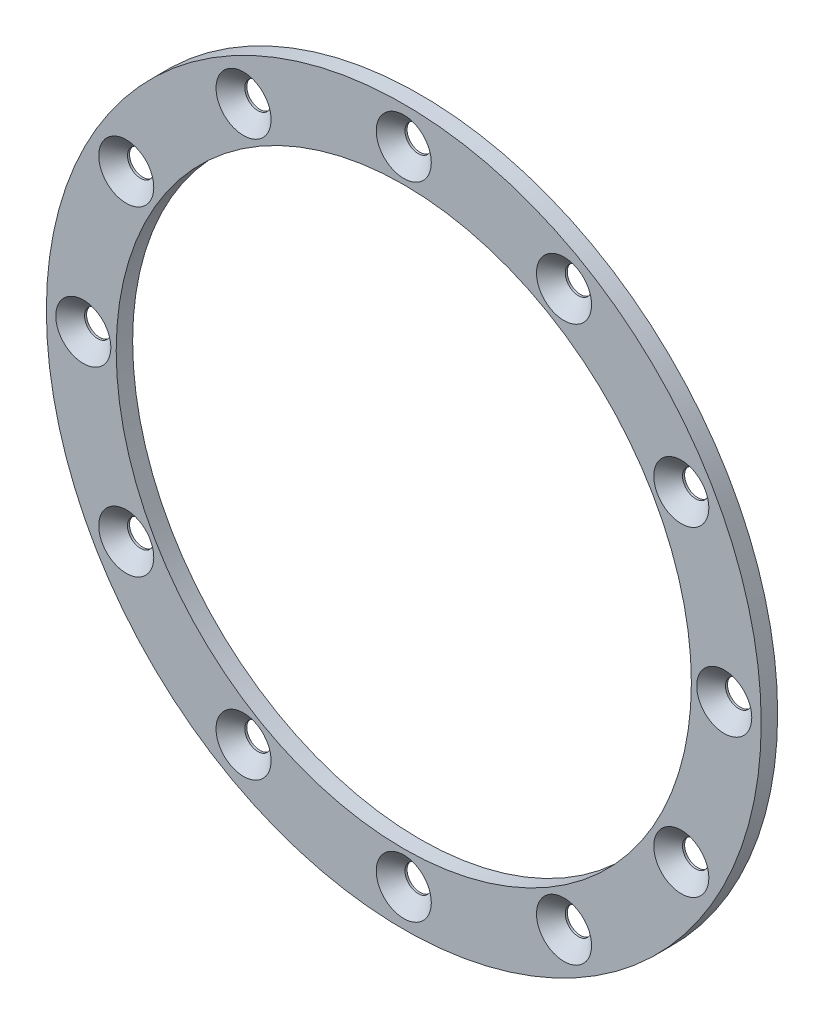
ISO-10303-21;
HEADER;
FILE_DESCRIPTION(('STEP AP214'),'2;1');
FILE_NAME('part.step','',(''),(''),'','','');
FILE_SCHEMA(('AUTOMOTIVE_DESIGN { 1 0 10303 214 1 1 1 1 }'));
ENDSEC;
DATA;
#1=APPLICATION_CONTEXT('core data for automotive mechanical design processes');
#2=APPLICATION_PROTOCOL_DEFINITION('international standard','automotive_design',2000,#1);
#3=PRODUCT_CONTEXT('',#1,'mechanical');
#4=PRODUCT('Part','Part','',(#3));
#5=PRODUCT_RELATED_PRODUCT_CATEGORY('part','',(#4));
#6=PRODUCT_DEFINITION_FORMATION('','',#4);
#7=PRODUCT_DEFINITION_CONTEXT('part definition',#1,'design');
#8=PRODUCT_DEFINITION('design','',#6,#7);
#9=PRODUCT_DEFINITION_SHAPE('','',#8);
#10=(LENGTH_UNIT() NAMED_UNIT(*) SI_UNIT(.MILLI.,.METRE.));
#11=(NAMED_UNIT(*) PLANE_ANGLE_UNIT() SI_UNIT($,.RADIAN.));
#12=(NAMED_UNIT(*) SI_UNIT($,.STERADIAN.) SOLID_ANGLE_UNIT());
#13=UNCERTAINTY_MEASURE_WITH_UNIT(LENGTH_MEASURE(1.E-05),#10,'distance_accuracy_value','');
#14=(GEOMETRIC_REPRESENTATION_CONTEXT(3) GLOBAL_UNCERTAINTY_ASSIGNED_CONTEXT((#13)) GLOBAL_UNIT_ASSIGNED_CONTEXT((#10,
#11,#12)) REPRESENTATION_CONTEXT('',''));
#15=CARTESIAN_POINT('',(0.,0.,0.));
#16=DIRECTION('',(0.,0.,1.));
#17=DIRECTION('',(1.,0.,0.));
#18=AXIS2_PLACEMENT_3D('',#15,#16,#17);
#19=CARTESIAN_POINT('',(0.,0.,2.));
#20=DIRECTION('',(0.,0.,1.));
#21=DIRECTION('',(1.,0.,0.));
#22=AXIS2_PLACEMENT_3D('',#19,#20,#21);
#23=PLANE('',#22);
#24=CARTESIAN_POINT('',(19.4999999999996,33.7749907475933,2.));
#25=DIRECTION('',(0.,0.,1.));
#26=DIRECTION('',(1.,0.,0.));
#27=AXIS2_PLACEMENT_3D('',#24,#25,#26);
#28=CIRCLE('',#27,3.35);
#29=CARTESIAN_POINT('',(22.8499999999996,33.7749907475933,2.));
#30=VERTEX_POINT('',#29);
#31=EDGE_CURVE('E155',#30,#30,#28,.T.);
#32=ORIENTED_EDGE('',*,*,#31,.F.);
#33=EDGE_LOOP('',(#32));
#34=FACE_BOUND('',#33,.T.);
#35=CARTESIAN_POINT('',(33.7749907475929,19.5000000000004,2.));
#36=DIRECTION('',(0.,0.,1.));
#37=DIRECTION('',(1.,0.,0.));
#38=AXIS2_PLACEMENT_3D('',#35,#36,#37);
#39=CIRCLE('',#38,3.35);
#40=CARTESIAN_POINT('',(37.1249907475929,19.5000000000004,2.));
#41=VERTEX_POINT('',#40);
#42=EDGE_CURVE('E146',#41,#41,#39,.T.);
#43=ORIENTED_EDGE('',*,*,#42,.F.);
#44=EDGE_LOOP('',(#43));
#45=FACE_BOUND('',#44,.T.);
#46=CARTESIAN_POINT('',(39.,4.08503316644647E-13,2.));
#47=DIRECTION('',(0.,0.,1.));
#48=DIRECTION('',(1.,0.,0.));
#49=AXIS2_PLACEMENT_3D('',#46,#47,#48);
#50=CIRCLE('',#49,3.35);
#51=CARTESIAN_POINT('',(42.35,4.08503316644647E-13,2.));
#52=VERTEX_POINT('',#51);
#53=EDGE_CURVE('E137',#52,#52,#50,.T.);
#54=ORIENTED_EDGE('',*,*,#53,.F.);
#55=EDGE_LOOP('',(#54));
#56=FACE_BOUND('',#55,.T.);
#57=CARTESIAN_POINT('',(33.7749907475933,-19.4999999999997,2.));
#58=DIRECTION('',(0.,0.,1.));
#59=DIRECTION('',(1.,0.,0.));
#60=AXIS2_PLACEMENT_3D('',#57,#58,#59);
#61=CIRCLE('',#60,3.35);
#62=CARTESIAN_POINT('',(37.1249907475933,-19.4999999999997,2.));
#63=VERTEX_POINT('',#62);
#64=EDGE_CURVE('E128',#63,#63,#61,.T.);
#65=ORIENTED_EDGE('',*,*,#64,.F.);
#66=EDGE_LOOP('',(#65));
#67=FACE_BOUND('',#66,.T.);
#68=CARTESIAN_POINT('',(19.5000000000003,-33.774990747593,2.));
#69=DIRECTION('',(0.,0.,1.));
#70=DIRECTION('',(1.,0.,0.));
#71=AXIS2_PLACEMENT_3D('',#68,#69,#70);
#72=CIRCLE('',#71,3.35);
#73=CARTESIAN_POINT('',(22.8500000000003,-33.774990747593,2.));
#74=VERTEX_POINT('',#73);
#75=EDGE_CURVE('E119',#74,#74,#72,.T.);
#76=ORIENTED_EDGE('',*,*,#75,.F.);
#77=EDGE_LOOP('',(#76));
#78=FACE_BOUND('',#77,.T.);
#79=CARTESIAN_POINT('',(0.,-39.,2.));
#80=DIRECTION('',(0.,0.,1.));
#81=DIRECTION('',(1.,0.,0.));
#82=AXIS2_PLACEMENT_3D('',#79,#80,#81);
#83=CIRCLE('',#82,3.35);
#84=CARTESIAN_POINT('',(3.35,-39.,2.));
#85=VERTEX_POINT('',#84);
#86=EDGE_CURVE('E110',#85,#85,#83,.T.);
#87=ORIENTED_EDGE('',*,*,#86,.F.);
#88=EDGE_LOOP('',(#87));
#89=FACE_BOUND('',#88,.T.);
#90=CARTESIAN_POINT('',(-19.4999999999998,-33.7749907475932,2.));
#91=DIRECTION('',(0.,0.,1.));
#92=DIRECTION('',(1.,0.,0.));
#93=AXIS2_PLACEMENT_3D('',#90,#91,#92);
#94=CIRCLE('',#93,3.35);
#95=CARTESIAN_POINT('',(-16.1499999999998,-33.7749907475932,2.));
#96=VERTEX_POINT('',#95);
#97=EDGE_CURVE('E101',#96,#96,#94,.T.);
#98=ORIENTED_EDGE('',*,*,#97,.F.);
#99=EDGE_LOOP('',(#98));
#100=FACE_BOUND('',#99,.T.);
#101=CARTESIAN_POINT('',(-33.774990747593,-19.5000000000002,2.));
#102=DIRECTION('',(0.,0.,1.));
#103=DIRECTION('',(1.,0.,0.));
#104=AXIS2_PLACEMENT_3D('',#101,#102,#103);
#105=CIRCLE('',#104,3.35);
#106=CARTESIAN_POINT('',(-30.424990747593,-19.5000000000002,2.));
#107=VERTEX_POINT('',#106);
#108=EDGE_CURVE('E92',#107,#107,#105,.T.);
#109=ORIENTED_EDGE('',*,*,#108,.F.);
#110=EDGE_LOOP('',(#109));
#111=FACE_BOUND('',#110,.T.);
#112=CARTESIAN_POINT('',(-39.,-1.36167772214882E-13,2.));
#113=DIRECTION('',(0.,0.,1.));
#114=DIRECTION('',(1.,0.,0.));
#115=AXIS2_PLACEMENT_3D('',#112,#113,#114);
#116=CIRCLE('',#115,3.35);
#117=CARTESIAN_POINT('',(-35.65,-1.36167772214882E-13,2.));
#118=VERTEX_POINT('',#117);
#119=EDGE_CURVE('E83',#118,#118,#116,.T.);
#120=ORIENTED_EDGE('',*,*,#119,.F.);
#121=EDGE_LOOP('',(#120));
#122=FACE_BOUND('',#121,.T.);
#123=CARTESIAN_POINT('',(-33.7749907475932,19.4999999999999,2.));
#124=DIRECTION('',(0.,0.,1.));
#125=DIRECTION('',(1.,0.,0.));
#126=AXIS2_PLACEMENT_3D('',#123,#124,#125);
#127=CIRCLE('',#126,3.35);
#128=CARTESIAN_POINT('',(-30.4249907475932,19.4999999999999,2.));
#129=VERTEX_POINT('',#128);
#130=EDGE_CURVE('E74',#129,#129,#127,.T.);
#131=ORIENTED_EDGE('',*,*,#130,.F.);
#132=EDGE_LOOP('',(#131));
#133=FACE_BOUND('',#132,.T.);
#134=CARTESIAN_POINT('',(-19.5,33.7749907475931,2.));
#135=DIRECTION('',(0.,0.,1.));
#136=DIRECTION('',(1.,0.,0.));
#137=AXIS2_PLACEMENT_3D('',#134,#135,#136);
#138=CIRCLE('',#137,3.35);
#139=CARTESIAN_POINT('',(-16.15,33.7749907475931,2.));
#140=VERTEX_POINT('',#139);
#141=EDGE_CURVE('E65',#140,#140,#138,.T.);
#142=ORIENTED_EDGE('',*,*,#141,.F.);
#143=EDGE_LOOP('',(#142));
#144=FACE_BOUND('',#143,.T.);
#145=CARTESIAN_POINT('',(0.,39.,2.));
#146=DIRECTION('',(0.,0.,1.));
#147=DIRECTION('',(1.,0.,0.));
#148=AXIS2_PLACEMENT_3D('',#145,#146,#147);
#149=CIRCLE('',#148,3.35);
#150=CARTESIAN_POINT('',(3.35,39.,2.));
#151=VERTEX_POINT('',#150);
#152=EDGE_CURVE('E56',#151,#151,#149,.T.);
#153=ORIENTED_EDGE('',*,*,#152,.F.);
#154=EDGE_LOOP('',(#153));
#155=FACE_BOUND('',#154,.T.);
#156=CARTESIAN_POINT('',(0.,0.,2.));
#157=DIRECTION('',(0.,0.,1.));
#158=DIRECTION('',(1.,0.,0.));
#159=AXIS2_PLACEMENT_3D('',#156,#157,#158);
#160=CIRCLE('',#159,43.5);
#161=CARTESIAN_POINT('',(43.5,0.,2.));
#162=VERTEX_POINT('',#161);
#163=EDGE_CURVE('E10',#162,#162,#160,.T.);
#164=ORIENTED_EDGE('',*,*,#163,.T.);
#165=EDGE_LOOP('',(#164));
#166=FACE_BOUND('',#165,.T.);
#167=CARTESIAN_POINT('',(0.,0.,2.));
#168=DIRECTION('',(0.,0.,1.));
#169=DIRECTION('',(1.,0.,0.));
#170=AXIS2_PLACEMENT_3D('',#167,#168,#169);
#171=CIRCLE('',#170,35.);
#172=CARTESIAN_POINT('',(35.,0.,2.));
#173=VERTEX_POINT('',#172);
#174=EDGE_CURVE('E43',#173,#173,#171,.T.);
#175=ORIENTED_EDGE('',*,*,#174,.F.);
#176=EDGE_LOOP('',(#175));
#177=FACE_BOUND('',#176,.T.);
#178=ADVANCED_FACE('F32',(#34,#45,#56,#67,#78,#89,#100,#111,#122,#133,#144,#155,#166,#177),#23,.T.);
#179=CARTESIAN_POINT('',(0.,0.,0.));
#180=DIRECTION('',(0.,0.,1.));
#181=DIRECTION('',(1.,0.,0.));
#182=AXIS2_PLACEMENT_3D('',#179,#180,#181);
#183=PLANE('',#182);
#184=CARTESIAN_POINT('',(19.4999999999996,33.7749907475933,0.));
#185=DIRECTION('',(0.,0.,1.));
#186=DIRECTION('',(1.,0.,0.));
#187=AXIS2_PLACEMENT_3D('',#184,#185,#186);
#188=CIRCLE('',#187,1.6);
#189=CARTESIAN_POINT('',(21.0999999999996,33.7749907475933,0.));
#190=VERTEX_POINT('',#189);
#191=EDGE_CURVE('E149',#190,#190,#188,.T.);
#192=ORIENTED_EDGE('',*,*,#191,.T.);
#193=EDGE_LOOP('',(#192));
#194=FACE_BOUND('',#193,.T.);
#195=CARTESIAN_POINT('',(33.7749907475929,19.5000000000004,0.));
#196=DIRECTION('',(0.,0.,1.));
#197=DIRECTION('',(1.,0.,0.));
#198=AXIS2_PLACEMENT_3D('',#195,#196,#197);
#199=CIRCLE('',#198,1.6);
#200=CARTESIAN_POINT('',(35.3749907475929,19.5000000000004,0.));
#201=VERTEX_POINT('',#200);
#202=EDGE_CURVE('E140',#201,#201,#199,.T.);
#203=ORIENTED_EDGE('',*,*,#202,.T.);
#204=EDGE_LOOP('',(#203));
#205=FACE_BOUND('',#204,.T.);
#206=CARTESIAN_POINT('',(39.,4.08503316644647E-13,0.));
#207=DIRECTION('',(0.,0.,1.));
#208=DIRECTION('',(1.,0.,0.));
#209=AXIS2_PLACEMENT_3D('',#206,#207,#208);
#210=CIRCLE('',#209,1.6);
#211=CARTESIAN_POINT('',(40.6,4.08503316644647E-13,0.));
#212=VERTEX_POINT('',#211);
#213=EDGE_CURVE('E131',#212,#212,#210,.T.);
#214=ORIENTED_EDGE('',*,*,#213,.T.);
#215=EDGE_LOOP('',(#214));
#216=FACE_BOUND('',#215,.T.);
#217=CARTESIAN_POINT('',(33.7749907475933,-19.4999999999997,0.));
#218=DIRECTION('',(0.,0.,1.));
#219=DIRECTION('',(1.,0.,0.));
#220=AXIS2_PLACEMENT_3D('',#217,#218,#219);
#221=CIRCLE('',#220,1.6);
#222=CARTESIAN_POINT('',(35.3749907475933,-19.4999999999997,0.));
#223=VERTEX_POINT('',#222);
#224=EDGE_CURVE('E122',#223,#223,#221,.T.);
#225=ORIENTED_EDGE('',*,*,#224,.T.);
#226=EDGE_LOOP('',(#225));
#227=FACE_BOUND('',#226,.T.);
#228=CARTESIAN_POINT('',(19.5000000000003,-33.774990747593,0.));
#229=DIRECTION('',(0.,0.,1.));
#230=DIRECTION('',(1.,0.,0.));
#231=AXIS2_PLACEMENT_3D('',#228,#229,#230);
#232=CIRCLE('',#231,1.6);
#233=CARTESIAN_POINT('',(21.1000000000003,-33.774990747593,0.));
#234=VERTEX_POINT('',#233);
#235=EDGE_CURVE('E113',#234,#234,#232,.T.);
#236=ORIENTED_EDGE('',*,*,#235,.T.);
#237=EDGE_LOOP('',(#236));
#238=FACE_BOUND('',#237,.T.);
#239=CARTESIAN_POINT('',(0.,-39.,0.));
#240=DIRECTION('',(0.,0.,1.));
#241=DIRECTION('',(1.,0.,0.));
#242=AXIS2_PLACEMENT_3D('',#239,#240,#241);
#243=CIRCLE('',#242,1.6);
#244=CARTESIAN_POINT('',(1.6,-39.,0.));
#245=VERTEX_POINT('',#244);
#246=EDGE_CURVE('E104',#245,#245,#243,.T.);
#247=ORIENTED_EDGE('',*,*,#246,.T.);
#248=EDGE_LOOP('',(#247));
#249=FACE_BOUND('',#248,.T.);
#250=CARTESIAN_POINT('',(-19.4999999999998,-33.7749907475932,0.));
#251=DIRECTION('',(0.,0.,1.));
#252=DIRECTION('',(1.,0.,0.));
#253=AXIS2_PLACEMENT_3D('',#250,#251,#252);
#254=CIRCLE('',#253,1.6);
#255=CARTESIAN_POINT('',(-17.8999999999998,-33.7749907475932,0.));
#256=VERTEX_POINT('',#255);
#257=EDGE_CURVE('E95',#256,#256,#254,.T.);
#258=ORIENTED_EDGE('',*,*,#257,.T.);
#259=EDGE_LOOP('',(#258));
#260=FACE_BOUND('',#259,.T.);
#261=CARTESIAN_POINT('',(-33.774990747593,-19.5000000000002,0.));
#262=DIRECTION('',(0.,0.,1.));
#263=DIRECTION('',(1.,0.,0.));
#264=AXIS2_PLACEMENT_3D('',#261,#262,#263);
#265=CIRCLE('',#264,1.6);
#266=CARTESIAN_POINT('',(-32.174990747593,-19.5000000000002,0.));
#267=VERTEX_POINT('',#266);
#268=EDGE_CURVE('E86',#267,#267,#265,.T.);
#269=ORIENTED_EDGE('',*,*,#268,.T.);
#270=EDGE_LOOP('',(#269));
#271=FACE_BOUND('',#270,.T.);
#272=CARTESIAN_POINT('',(-39.,-1.36167772214882E-13,0.));
#273=DIRECTION('',(0.,0.,1.));
#274=DIRECTION('',(1.,0.,0.));
#275=AXIS2_PLACEMENT_3D('',#272,#273,#274);
#276=CIRCLE('',#275,1.6);
#277=CARTESIAN_POINT('',(-37.4,-1.36167772214882E-13,0.));
#278=VERTEX_POINT('',#277);
#279=EDGE_CURVE('E77',#278,#278,#276,.T.);
#280=ORIENTED_EDGE('',*,*,#279,.T.);
#281=EDGE_LOOP('',(#280));
#282=FACE_BOUND('',#281,.T.);
#283=CARTESIAN_POINT('',(-33.7749907475932,19.4999999999999,0.));
#284=DIRECTION('',(0.,0.,1.));
#285=DIRECTION('',(1.,0.,0.));
#286=AXIS2_PLACEMENT_3D('',#283,#284,#285);
#287=CIRCLE('',#286,1.6);
#288=CARTESIAN_POINT('',(-32.1749907475932,19.4999999999999,0.));
#289=VERTEX_POINT('',#288);
#290=EDGE_CURVE('E68',#289,#289,#287,.T.);
#291=ORIENTED_EDGE('',*,*,#290,.T.);
#292=EDGE_LOOP('',(#291));
#293=FACE_BOUND('',#292,.T.);
#294=CARTESIAN_POINT('',(-19.5,33.7749907475931,0.));
#295=DIRECTION('',(0.,0.,1.));
#296=DIRECTION('',(1.,0.,0.));
#297=AXIS2_PLACEMENT_3D('',#294,#295,#296);
#298=CIRCLE('',#297,1.6);
#299=CARTESIAN_POINT('',(-17.9,33.7749907475931,0.));
#300=VERTEX_POINT('',#299);
#301=EDGE_CURVE('E59',#300,#300,#298,.T.);
#302=ORIENTED_EDGE('',*,*,#301,.T.);
#303=EDGE_LOOP('',(#302));
#304=FACE_BOUND('',#303,.T.);
#305=CARTESIAN_POINT('',(0.,39.,0.));
#306=DIRECTION('',(0.,0.,1.));
#307=DIRECTION('',(1.,0.,0.));
#308=AXIS2_PLACEMENT_3D('',#305,#306,#307);
#309=CIRCLE('',#308,1.6);
#310=CARTESIAN_POINT('',(1.6,39.,0.));
#311=VERTEX_POINT('',#310);
#312=EDGE_CURVE('E48',#311,#311,#309,.T.);
#313=ORIENTED_EDGE('',*,*,#312,.T.);
#314=EDGE_LOOP('',(#313));
#315=FACE_BOUND('',#314,.T.);
#316=CARTESIAN_POINT('',(0.,0.,0.));
#317=DIRECTION('',(0.,0.,1.));
#318=DIRECTION('',(1.,0.,0.));
#319=AXIS2_PLACEMENT_3D('',#316,#317,#318);
#320=CIRCLE('',#319,43.5);
#321=CARTESIAN_POINT('',(43.5,0.,0.));
#322=VERTEX_POINT('',#321);
#323=EDGE_CURVE('E36',#322,#322,#320,.T.);
#324=ORIENTED_EDGE('',*,*,#323,.F.);
#325=EDGE_LOOP('',(#324));
#326=FACE_BOUND('',#325,.T.);
#327=CARTESIAN_POINT('',(0.,0.,0.));
#328=DIRECTION('',(0.,0.,1.));
#329=DIRECTION('',(1.,0.,0.));
#330=AXIS2_PLACEMENT_3D('',#327,#328,#329);
#331=CIRCLE('',#330,35.);
#332=CARTESIAN_POINT('',(35.,0.,0.));
#333=VERTEX_POINT('',#332);
#334=EDGE_CURVE('E45',#333,#333,#331,.T.);
#335=ORIENTED_EDGE('',*,*,#334,.T.);
#336=EDGE_LOOP('',(#335));
#337=FACE_BOUND('',#336,.T.);
#338=ADVANCED_FACE('F163',(#194,#205,#216,#227,#238,#249,#260,#271,#282,#293,#304,#315,#326,
#337),#183,.F.);
#339=CARTESIAN_POINT('',(0.,0.,2.));
#340=DIRECTION('',(0.,0.,-1.));
#341=DIRECTION('',(-1.,0.,0.));
#342=AXIS2_PLACEMENT_3D('',#339,#340,#341);
#343=CYLINDRICAL_SURFACE('',#342,43.5);
#344=ORIENTED_EDGE('',*,*,#163,.F.);
#345=EDGE_LOOP('',(#344));
#346=FACE_BOUND('',#345,.T.);
#347=ORIENTED_EDGE('',*,*,#323,.T.);
#348=EDGE_LOOP('',(#347));
#349=FACE_BOUND('',#348,.T.);
#350=ADVANCED_FACE('F34',(#346,#349),#343,.T.);
#351=CARTESIAN_POINT('',(0.,0.,2.));
#352=DIRECTION('',(0.,0.,-1.));
#353=DIRECTION('',(-1.,0.,0.));
#354=AXIS2_PLACEMENT_3D('',#351,#352,#353);
#355=CYLINDRICAL_SURFACE('',#354,35.);
#356=ORIENTED_EDGE('',*,*,#174,.T.);
#357=EDGE_LOOP('',(#356));
#358=FACE_BOUND('',#357,.T.);
#359=ORIENTED_EDGE('',*,*,#334,.F.);
#360=EDGE_LOOP('',(#359));
#361=FACE_BOUND('',#360,.T.);
#362=ADVANCED_FACE('F189',(#358,#361),#355,.F.);
#363=CARTESIAN_POINT('',(0.,39.,2.));
#364=DIRECTION('',(0.,0.,1.));
#365=DIRECTION('',(1.,0.,0.));
#366=AXIS2_PLACEMENT_3D('',#363,#364,#365);
#367=CYLINDRICAL_SURFACE('',#366,1.59999999999999);
#368=ORIENTED_EDGE('',*,*,#312,.F.);
#369=EDGE_LOOP('',(#368));
#370=FACE_BOUND('',#369,.T.);
#371=CARTESIAN_POINT('',(0.,39.,0.250000000000012));
#372=DIRECTION('',(0.,0.,1.));
#373=DIRECTION('',(1.,0.,0.));
#374=AXIS2_PLACEMENT_3D('',#371,#372,#373);
#375=CIRCLE('',#374,1.59999999999999);
#376=CARTESIAN_POINT('',(1.59999999999999,39.,0.250000000000012));
#377=VERTEX_POINT('',#376);
#378=EDGE_CURVE('E53',#377,#377,#375,.T.);
#379=ORIENTED_EDGE('',*,*,#378,.T.);
#380=EDGE_LOOP('',(#379));
#381=FACE_BOUND('',#380,.T.);
#382=ADVANCED_FACE('F192',(#370,#381),#367,.F.);
#383=CARTESIAN_POINT('',(0.,39.,2.));
#384=DIRECTION('',(0.,0.,1.));
#385=DIRECTION('',(1.,0.,0.));
#386=AXIS2_PLACEMENT_3D('',#383,#384,#385);
#387=CONICAL_SURFACE('',#386,3.35,0.785398163397455);
#388=ORIENTED_EDGE('',*,*,#378,.F.);
#389=EDGE_LOOP('',(#388));
#390=FACE_BOUND('',#389,.T.);
#391=ORIENTED_EDGE('',*,*,#152,.T.);
#392=EDGE_LOOP('',(#391));
#393=FACE_BOUND('',#392,.T.);
#394=ADVANCED_FACE('F206',(#390,#393),#387,.F.);
#395=CARTESIAN_POINT('',(-19.5,33.7749907475931,2.));
#396=DIRECTION('',(0.,0.,1.));
#397=DIRECTION('',(1.,0.,0.));
#398=AXIS2_PLACEMENT_3D('',#395,#396,#397);
#399=CYLINDRICAL_SURFACE('',#398,1.59999999999999);
#400=ORIENTED_EDGE('',*,*,#301,.F.);
#401=EDGE_LOOP('',(#400));
#402=FACE_BOUND('',#401,.T.);
#403=CARTESIAN_POINT('',(-19.5,33.7749907475931,0.250000000000012));
#404=DIRECTION('',(0.,0.,1.));
#405=DIRECTION('',(1.,0.,0.));
#406=AXIS2_PLACEMENT_3D('',#403,#404,#405);
#407=CIRCLE('',#406,1.59999999999999);
#408=CARTESIAN_POINT('',(-17.9000000000001,33.7749907475931,0.250000000000012));
#409=VERTEX_POINT('',#408);
#410=EDGE_CURVE('E62',#409,#409,#407,.T.);
#411=ORIENTED_EDGE('',*,*,#410,.T.);
#412=EDGE_LOOP('',(#411));
#413=FACE_BOUND('',#412,.T.);
#414=ADVANCED_FACE('F210',(#402,#413),#399,.F.);
#415=CARTESIAN_POINT('',(-19.5,33.7749907475931,2.));
#416=DIRECTION('',(0.,0.,1.));
#417=DIRECTION('',(1.,0.,0.));
#418=AXIS2_PLACEMENT_3D('',#415,#416,#417);
#419=CONICAL_SURFACE('',#418,3.35,0.785398163397455);
#420=ORIENTED_EDGE('',*,*,#410,.F.);
#421=EDGE_LOOP('',(#420));
#422=FACE_BOUND('',#421,.T.);
#423=ORIENTED_EDGE('',*,*,#141,.T.);
#424=EDGE_LOOP('',(#423));
#425=FACE_BOUND('',#424,.T.);
#426=ADVANCED_FACE('F214',(#422,#425),#419,.F.);
#427=CARTESIAN_POINT('',(-33.7749907475932,19.4999999999999,2.));
#428=DIRECTION('',(0.,0.,1.));
#429=DIRECTION('',(1.,0.,0.));
#430=AXIS2_PLACEMENT_3D('',#427,#428,#429);
#431=CYLINDRICAL_SURFACE('',#430,1.59999999999999);
#432=ORIENTED_EDGE('',*,*,#290,.F.);
#433=EDGE_LOOP('',(#432));
#434=FACE_BOUND('',#433,.T.);
#435=CARTESIAN_POINT('',(-33.7749907475932,19.4999999999999,0.250000000000012));
#436=DIRECTION('',(0.,0.,1.));
#437=DIRECTION('',(1.,0.,0.));
#438=AXIS2_PLACEMENT_3D('',#435,#436,#437);
#439=CIRCLE('',#438,1.59999999999998);
#440=CARTESIAN_POINT('',(-32.1749907475932,19.4999999999999,0.250000000000012));
#441=VERTEX_POINT('',#440);
#442=EDGE_CURVE('E71',#441,#441,#439,.T.);
#443=ORIENTED_EDGE('',*,*,#442,.T.);
#444=EDGE_LOOP('',(#443));
#445=FACE_BOUND('',#444,.T.);
#446=ADVANCED_FACE('F218',(#434,#445),#431,.F.);
#447=CARTESIAN_POINT('',(-33.7749907475932,19.4999999999999,2.));
#448=DIRECTION('',(0.,0.,1.));
#449=DIRECTION('',(1.,0.,0.));
#450=AXIS2_PLACEMENT_3D('',#447,#448,#449);
#451=CONICAL_SURFACE('',#450,3.35,0.785398163397456);
#452=ORIENTED_EDGE('',*,*,#442,.F.);
#453=EDGE_LOOP('',(#452));
#454=FACE_BOUND('',#453,.T.);
#455=ORIENTED_EDGE('',*,*,#130,.T.);
#456=EDGE_LOOP('',(#455));
#457=FACE_BOUND('',#456,.T.);
#458=ADVANCED_FACE('F222',(#454,#457),#451,.F.);
#459=CARTESIAN_POINT('',(-39.,-1.36167772214882E-13,2.));
#460=DIRECTION('',(0.,0.,1.));
#461=DIRECTION('',(1.,0.,0.));
#462=AXIS2_PLACEMENT_3D('',#459,#460,#461);
#463=CYLINDRICAL_SURFACE('',#462,1.59999999999999);
#464=ORIENTED_EDGE('',*,*,#279,.F.);
#465=EDGE_LOOP('',(#464));
#466=FACE_BOUND('',#465,.T.);
#467=CARTESIAN_POINT('',(-39.,-1.36167772214882E-13,0.250000000000012));
#468=DIRECTION('',(0.,0.,1.));
#469=DIRECTION('',(1.,0.,0.));
#470=AXIS2_PLACEMENT_3D('',#467,#468,#469);
#471=CIRCLE('',#470,1.59999999999998);
#472=CARTESIAN_POINT('',(-37.4,-1.36167772214882E-13,0.250000000000012));
#473=VERTEX_POINT('',#472);
#474=EDGE_CURVE('E80',#473,#473,#471,.T.);
#475=ORIENTED_EDGE('',*,*,#474,.T.);
#476=EDGE_LOOP('',(#475));
#477=FACE_BOUND('',#476,.T.);
#478=ADVANCED_FACE('F226',(#466,#477),#463,.F.);
#479=CARTESIAN_POINT('',(-39.,-1.36167772214882E-13,2.));
#480=DIRECTION('',(0.,0.,1.));
#481=DIRECTION('',(1.,0.,0.));
#482=AXIS2_PLACEMENT_3D('',#479,#480,#481);
#483=CONICAL_SURFACE('',#482,3.35,0.785398163397456);
#484=ORIENTED_EDGE('',*,*,#474,.F.);
#485=EDGE_LOOP('',(#484));
#486=FACE_BOUND('',#485,.T.);
#487=ORIENTED_EDGE('',*,*,#119,.T.);
#488=EDGE_LOOP('',(#487));
#489=FACE_BOUND('',#488,.T.);
#490=ADVANCED_FACE('F230',(#486,#489),#483,.F.);
#491=CARTESIAN_POINT('',(-33.774990747593,-19.5000000000002,2.));
#492=DIRECTION('',(0.,0.,1.));
#493=DIRECTION('',(1.,0.,0.));
#494=AXIS2_PLACEMENT_3D('',#491,#492,#493);
#495=CYLINDRICAL_SURFACE('',#494,1.59999999999999);
#496=ORIENTED_EDGE('',*,*,#268,.F.);
#497=EDGE_LOOP('',(#496));
#498=FACE_BOUND('',#497,.T.);
#499=CARTESIAN_POINT('',(-33.774990747593,-19.5000000000002,0.250000000000012));
#500=DIRECTION('',(0.,0.,1.));
#501=DIRECTION('',(1.,0.,0.));
#502=AXIS2_PLACEMENT_3D('',#499,#500,#501);
#503=CIRCLE('',#502,1.59999999999999);
#504=CARTESIAN_POINT('',(-32.174990747593,-19.5000000000002,0.250000000000012));
#505=VERTEX_POINT('',#504);
#506=EDGE_CURVE('E89',#505,#505,#503,.T.);
#507=ORIENTED_EDGE('',*,*,#506,.T.);
#508=EDGE_LOOP('',(#507));
#509=FACE_BOUND('',#508,.T.);
#510=ADVANCED_FACE('F234',(#498,#509),#495,.F.);
#511=CARTESIAN_POINT('',(-33.774990747593,-19.5000000000002,2.));
#512=DIRECTION('',(0.,0.,1.));
#513=DIRECTION('',(1.,0.,0.));
#514=AXIS2_PLACEMENT_3D('',#511,#512,#513);
#515=CONICAL_SURFACE('',#514,3.35,0.785398163397454);
#516=ORIENTED_EDGE('',*,*,#506,.F.);
#517=EDGE_LOOP('',(#516));
#518=FACE_BOUND('',#517,.T.);
#519=ORIENTED_EDGE('',*,*,#108,.T.);
#520=EDGE_LOOP('',(#519));
#521=FACE_BOUND('',#520,.T.);
#522=ADVANCED_FACE('F238',(#518,#521),#515,.F.);
#523=CARTESIAN_POINT('',(-19.4999999999998,-33.7749907475932,2.));
#524=DIRECTION('',(0.,0.,1.));
#525=DIRECTION('',(1.,0.,0.));
#526=AXIS2_PLACEMENT_3D('',#523,#524,#525);
#527=CYLINDRICAL_SURFACE('',#526,1.59999999999999);
#528=ORIENTED_EDGE('',*,*,#257,.F.);
#529=EDGE_LOOP('',(#528));
#530=FACE_BOUND('',#529,.T.);
#531=CARTESIAN_POINT('',(-19.4999999999998,-33.7749907475932,0.250000000000012));
#532=DIRECTION('',(0.,0.,1.));
#533=DIRECTION('',(1.,0.,0.));
#534=AXIS2_PLACEMENT_3D('',#531,#532,#533);
#535=CIRCLE('',#534,1.59999999999999);
#536=CARTESIAN_POINT('',(-17.8999999999998,-33.7749907475932,0.250000000000012));
#537=VERTEX_POINT('',#536);
#538=EDGE_CURVE('E98',#537,#537,#535,.T.);
#539=ORIENTED_EDGE('',*,*,#538,.T.);
#540=EDGE_LOOP('',(#539));
#541=FACE_BOUND('',#540,.T.);
#542=ADVANCED_FACE('F242',(#530,#541),#527,.F.);
#543=CARTESIAN_POINT('',(-19.4999999999998,-33.7749907475932,2.));
#544=DIRECTION('',(0.,0.,1.));
#545=DIRECTION('',(1.,0.,0.));
#546=AXIS2_PLACEMENT_3D('',#543,#544,#545);
#547=CONICAL_SURFACE('',#546,3.35,0.785398163397455);
#548=ORIENTED_EDGE('',*,*,#538,.F.);
#549=EDGE_LOOP('',(#548));
#550=FACE_BOUND('',#549,.T.);
#551=ORIENTED_EDGE('',*,*,#97,.T.);
#552=EDGE_LOOP('',(#551));
#553=FACE_BOUND('',#552,.T.);
#554=ADVANCED_FACE('F246',(#550,#553),#547,.F.);
#555=CARTESIAN_POINT('',(0.,-39.,2.));
#556=DIRECTION('',(0.,0.,1.));
#557=DIRECTION('',(1.,0.,0.));
#558=AXIS2_PLACEMENT_3D('',#555,#556,#557);
#559=CYLINDRICAL_SURFACE('',#558,1.59999999999999);
#560=ORIENTED_EDGE('',*,*,#246,.F.);
#561=EDGE_LOOP('',(#560));
#562=FACE_BOUND('',#561,.T.);
#563=CARTESIAN_POINT('',(0.,-39.,0.250000000000012));
#564=DIRECTION('',(0.,0.,1.));
#565=DIRECTION('',(1.,0.,0.));
#566=AXIS2_PLACEMENT_3D('',#563,#564,#565);
#567=CIRCLE('',#566,1.59999999999999);
#568=CARTESIAN_POINT('',(1.59999999999999,-39.,0.250000000000012));
#569=VERTEX_POINT('',#568);
#570=EDGE_CURVE('E107',#569,#569,#567,.T.);
#571=ORIENTED_EDGE('',*,*,#570,.T.);
#572=EDGE_LOOP('',(#571));
#573=FACE_BOUND('',#572,.T.);
#574=ADVANCED_FACE('F250',(#562,#573),#559,.F.);
#575=CARTESIAN_POINT('',(0.,-39.,2.));
#576=DIRECTION('',(0.,0.,1.));
#577=DIRECTION('',(1.,0.,0.));
#578=AXIS2_PLACEMENT_3D('',#575,#576,#577);
#579=CONICAL_SURFACE('',#578,3.35,0.785398163397455);
#580=ORIENTED_EDGE('',*,*,#570,.F.);
#581=EDGE_LOOP('',(#580));
#582=FACE_BOUND('',#581,.T.);
#583=ORIENTED_EDGE('',*,*,#86,.T.);
#584=EDGE_LOOP('',(#583));
#585=FACE_BOUND('',#584,.T.);
#586=ADVANCED_FACE('F254',(#582,#585),#579,.F.);
#587=CARTESIAN_POINT('',(19.5000000000003,-33.774990747593,2.));
#588=DIRECTION('',(0.,0.,1.));
#589=DIRECTION('',(1.,0.,0.));
#590=AXIS2_PLACEMENT_3D('',#587,#588,#589);
#591=CYLINDRICAL_SURFACE('',#590,1.59999999999999);
#592=ORIENTED_EDGE('',*,*,#235,.F.);
#593=EDGE_LOOP('',(#592));
#594=FACE_BOUND('',#593,.T.);
#595=CARTESIAN_POINT('',(19.5000000000003,-33.774990747593,0.250000000000012));
#596=DIRECTION('',(0.,0.,1.));
#597=DIRECTION('',(1.,0.,0.));
#598=AXIS2_PLACEMENT_3D('',#595,#596,#597);
#599=CIRCLE('',#598,1.59999999999999);
#600=CARTESIAN_POINT('',(21.1000000000003,-33.774990747593,0.250000000000012));
#601=VERTEX_POINT('',#600);
#602=EDGE_CURVE('E116',#601,#601,#599,.T.);
#603=ORIENTED_EDGE('',*,*,#602,.T.);
#604=EDGE_LOOP('',(#603));
#605=FACE_BOUND('',#604,.T.);
#606=ADVANCED_FACE('F258',(#594,#605),#591,.F.);
#607=CARTESIAN_POINT('',(19.5000000000003,-33.774990747593,2.));
#608=DIRECTION('',(0.,0.,1.));
#609=DIRECTION('',(1.,0.,0.));
#610=AXIS2_PLACEMENT_3D('',#607,#608,#609);
#611=CONICAL_SURFACE('',#610,3.35,0.785398163397456);
#612=ORIENTED_EDGE('',*,*,#602,.F.);
#613=EDGE_LOOP('',(#612));
#614=FACE_BOUND('',#613,.T.);
#615=ORIENTED_EDGE('',*,*,#75,.T.);
#616=EDGE_LOOP('',(#615));
#617=FACE_BOUND('',#616,.T.);
#618=ADVANCED_FACE('F262',(#614,#617),#611,.F.);
#619=CARTESIAN_POINT('',(33.7749907475933,-19.4999999999997,2.));
#620=DIRECTION('',(0.,0.,1.));
#621=DIRECTION('',(1.,0.,0.));
#622=AXIS2_PLACEMENT_3D('',#619,#620,#621);
#623=CYLINDRICAL_SURFACE('',#622,1.59999999999999);
#624=ORIENTED_EDGE('',*,*,#224,.F.);
#625=EDGE_LOOP('',(#624));
#626=FACE_BOUND('',#625,.T.);
#627=CARTESIAN_POINT('',(33.7749907475933,-19.4999999999997,0.250000000000012));
#628=DIRECTION('',(0.,0.,1.));
#629=DIRECTION('',(1.,0.,0.));
#630=AXIS2_PLACEMENT_3D('',#627,#628,#629);
#631=CIRCLE('',#630,1.59999999999999);
#632=CARTESIAN_POINT('',(35.3749907475933,-19.4999999999997,0.250000000000012));
#633=VERTEX_POINT('',#632);
#634=EDGE_CURVE('E125',#633,#633,#631,.T.);
#635=ORIENTED_EDGE('',*,*,#634,.T.);
#636=EDGE_LOOP('',(#635));
#637=FACE_BOUND('',#636,.T.);
#638=ADVANCED_FACE('F266',(#626,#637),#623,.F.);
#639=CARTESIAN_POINT('',(33.7749907475933,-19.4999999999997,2.));
#640=DIRECTION('',(0.,0.,1.));
#641=DIRECTION('',(1.,0.,0.));
#642=AXIS2_PLACEMENT_3D('',#639,#640,#641);
#643=CONICAL_SURFACE('',#642,3.35,0.785398163397454);
#644=ORIENTED_EDGE('',*,*,#634,.F.);
#645=EDGE_LOOP('',(#644));
#646=FACE_BOUND('',#645,.T.);
#647=ORIENTED_EDGE('',*,*,#64,.T.);
#648=EDGE_LOOP('',(#647));
#649=FACE_BOUND('',#648,.T.);
#650=ADVANCED_FACE('F270',(#646,#649),#643,.F.);
#651=CARTESIAN_POINT('',(39.,4.08503316644647E-13,2.));
#652=DIRECTION('',(0.,0.,1.));
#653=DIRECTION('',(1.,0.,0.));
#654=AXIS2_PLACEMENT_3D('',#651,#652,#653);
#655=CYLINDRICAL_SURFACE('',#654,1.59999999999999);
#656=ORIENTED_EDGE('',*,*,#213,.F.);
#657=EDGE_LOOP('',(#656));
#658=FACE_BOUND('',#657,.T.);
#659=CARTESIAN_POINT('',(39.,4.08503316644647E-13,0.250000000000012));
#660=DIRECTION('',(0.,0.,1.));
#661=DIRECTION('',(1.,0.,0.));
#662=AXIS2_PLACEMENT_3D('',#659,#660,#661);
#663=CIRCLE('',#662,1.59999999999998);
#664=CARTESIAN_POINT('',(40.6,4.08503316644647E-13,0.250000000000012));
#665=VERTEX_POINT('',#664);
#666=EDGE_CURVE('E134',#665,#665,#663,.T.);
#667=ORIENTED_EDGE('',*,*,#666,.T.);
#668=EDGE_LOOP('',(#667));
#669=FACE_BOUND('',#668,.T.);
#670=ADVANCED_FACE('F274',(#658,#669),#655,.F.);
#671=CARTESIAN_POINT('',(39.,4.08503316644647E-13,2.));
#672=DIRECTION('',(0.,0.,1.));
#673=DIRECTION('',(1.,0.,0.));
#674=AXIS2_PLACEMENT_3D('',#671,#672,#673);
#675=CONICAL_SURFACE('',#674,3.35,0.785398163397456);
#676=ORIENTED_EDGE('',*,*,#666,.F.);
#677=EDGE_LOOP('',(#676));
#678=FACE_BOUND('',#677,.T.);
#679=ORIENTED_EDGE('',*,*,#53,.T.);
#680=EDGE_LOOP('',(#679));
#681=FACE_BOUND('',#680,.T.);
#682=ADVANCED_FACE('F278',(#678,#681),#675,.F.);
#683=CARTESIAN_POINT('',(33.7749907475929,19.5000000000004,2.));
#684=DIRECTION('',(0.,0.,1.));
#685=DIRECTION('',(1.,0.,0.));
#686=AXIS2_PLACEMENT_3D('',#683,#684,#685);
#687=CYLINDRICAL_SURFACE('',#686,1.59999999999999);
#688=ORIENTED_EDGE('',*,*,#202,.F.);
#689=EDGE_LOOP('',(#688));
#690=FACE_BOUND('',#689,.T.);
#691=CARTESIAN_POINT('',(33.7749907475929,19.5000000000004,0.250000000000012));
#692=DIRECTION('',(0.,0.,1.));
#693=DIRECTION('',(1.,0.,0.));
#694=AXIS2_PLACEMENT_3D('',#691,#692,#693);
#695=CIRCLE('',#694,1.59999999999999);
#696=CARTESIAN_POINT('',(35.3749907475929,19.5000000000004,0.250000000000012));
#697=VERTEX_POINT('',#696);
#698=EDGE_CURVE('E143',#697,#697,#695,.T.);
#699=ORIENTED_EDGE('',*,*,#698,.T.);
#700=EDGE_LOOP('',(#699));
#701=FACE_BOUND('',#700,.T.);
#702=ADVANCED_FACE('F282',(#690,#701),#687,.F.);
#703=CARTESIAN_POINT('',(33.7749907475929,19.5000000000004,2.));
#704=DIRECTION('',(0.,0.,1.));
#705=DIRECTION('',(1.,0.,0.));
#706=AXIS2_PLACEMENT_3D('',#703,#704,#705);
#707=CONICAL_SURFACE('',#706,3.35,0.785398163397454);
#708=ORIENTED_EDGE('',*,*,#698,.F.);
#709=EDGE_LOOP('',(#708));
#710=FACE_BOUND('',#709,.T.);
#711=ORIENTED_EDGE('',*,*,#42,.T.);
#712=EDGE_LOOP('',(#711));
#713=FACE_BOUND('',#712,.T.);
#714=ADVANCED_FACE('F286',(#710,#713),#707,.F.);
#715=CARTESIAN_POINT('',(19.4999999999996,33.7749907475933,2.));
#716=DIRECTION('',(0.,0.,1.));
#717=DIRECTION('',(1.,0.,0.));
#718=AXIS2_PLACEMENT_3D('',#715,#716,#717);
#719=CYLINDRICAL_SURFACE('',#718,1.59999999999999);
#720=ORIENTED_EDGE('',*,*,#191,.F.);
#721=EDGE_LOOP('',(#720));
#722=FACE_BOUND('',#721,.T.);
#723=CARTESIAN_POINT('',(19.4999999999996,33.7749907475933,0.250000000000012));
#724=DIRECTION('',(0.,0.,1.));
#725=DIRECTION('',(1.,0.,0.));
#726=AXIS2_PLACEMENT_3D('',#723,#724,#725);
#727=CIRCLE('',#726,1.59999999999999);
#728=CARTESIAN_POINT('',(21.0999999999996,33.7749907475933,0.250000000000012));
#729=VERTEX_POINT('',#728);
#730=EDGE_CURVE('E152',#729,#729,#727,.T.);
#731=ORIENTED_EDGE('',*,*,#730,.T.);
#732=EDGE_LOOP('',(#731));
#733=FACE_BOUND('',#732,.T.);
#734=ADVANCED_FACE('F290',(#722,#733),#719,.F.);
#735=CARTESIAN_POINT('',(19.4999999999996,33.7749907475933,2.));
#736=DIRECTION('',(0.,0.,1.));
#737=DIRECTION('',(1.,0.,0.));
#738=AXIS2_PLACEMENT_3D('',#735,#736,#737);
#739=CONICAL_SURFACE('',#738,3.35,0.785398163397455);
#740=ORIENTED_EDGE('',*,*,#730,.F.);
#741=EDGE_LOOP('',(#740));
#742=FACE_BOUND('',#741,.T.);
#743=ORIENTED_EDGE('',*,*,#31,.T.);
#744=EDGE_LOOP('',(#743));
#745=FACE_BOUND('',#744,.T.);
#746=ADVANCED_FACE('F159',(#742,#745),#739,.F.);
#747=CLOSED_SHELL('',(#178,#338,#350,#362,#382,#394,#414,#426,#446,#458,#478,#490,#510,#522,
#542,#554,#574,#586,#606,#618,#638,#650,#670,#682,#702,#714,#734,#746));
#748=MANIFOLD_SOLID_BREP('B2',#747);
#749=ADVANCED_BREP_SHAPE_REPRESENTATION('',(#18,#748),#14);
#750=SHAPE_DEFINITION_REPRESENTATION(#9,#749);
ENDSEC;
END-ISO-10303-21;
